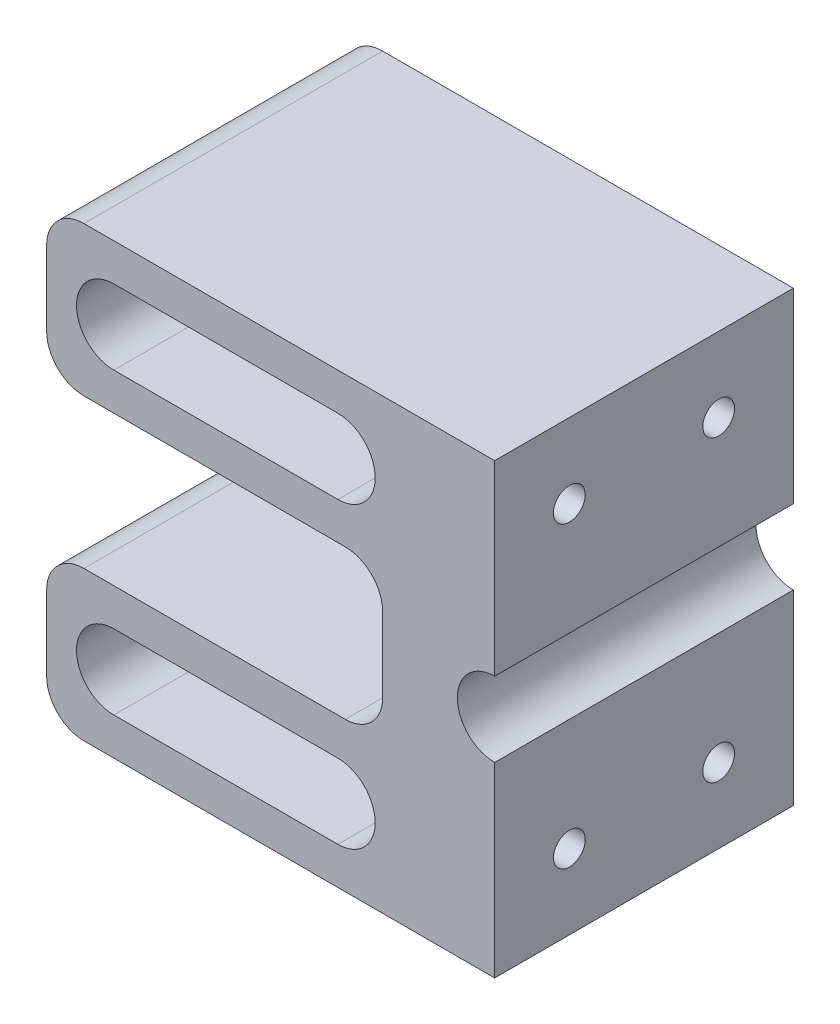
ISO-10303-21;
HEADER;
FILE_DESCRIPTION(('STEP AP214'),'2;1');
FILE_NAME('part.step','',(''),(''),'','','');
FILE_SCHEMA(('AUTOMOTIVE_DESIGN { 1 0 10303 214 1 1 1 1 }'));
ENDSEC;
DATA;
#1=APPLICATION_CONTEXT('core data for automotive mechanical design processes');
#2=APPLICATION_PROTOCOL_DEFINITION('international standard','automotive_design',2000,#1);
#3=PRODUCT_CONTEXT('',#1,'mechanical');
#4=PRODUCT('Part','Part','',(#3));
#5=PRODUCT_RELATED_PRODUCT_CATEGORY('part','',(#4));
#6=PRODUCT_DEFINITION_FORMATION('','',#4);
#7=PRODUCT_DEFINITION_CONTEXT('part definition',#1,'design');
#8=PRODUCT_DEFINITION('design','',#6,#7);
#9=PRODUCT_DEFINITION_SHAPE('','',#8);
#10=(LENGTH_UNIT() NAMED_UNIT(*) SI_UNIT(.MILLI.,.METRE.));
#11=(NAMED_UNIT(*) PLANE_ANGLE_UNIT() SI_UNIT($,.RADIAN.));
#12=(NAMED_UNIT(*) SI_UNIT($,.STERADIAN.) SOLID_ANGLE_UNIT());
#13=UNCERTAINTY_MEASURE_WITH_UNIT(LENGTH_MEASURE(1.E-05),#10,'distance_accuracy_value','');
#14=(GEOMETRIC_REPRESENTATION_CONTEXT(3) GLOBAL_UNCERTAINTY_ASSIGNED_CONTEXT((#13)) GLOBAL_UNIT_ASSIGNED_CONTEXT((#10,
#11,#12)) REPRESENTATION_CONTEXT('',''));
#15=CARTESIAN_POINT('',(0.,0.,0.));
#16=DIRECTION('',(0.,0.,1.));
#17=DIRECTION('',(1.,0.,0.));
#18=AXIS2_PLACEMENT_3D('',#15,#16,#17);
#19=CARTESIAN_POINT('',(0.,0.,12.7));
#20=DIRECTION('',(0.,0.,-1.));
#21=DIRECTION('',(-1.,0.,0.));
#22=AXIS2_PLACEMENT_3D('',#19,#20,#21);
#23=PLANE('',#22);
#24=CARTESIAN_POINT('',(-13.335,-19.05,12.7));
#25=DIRECTION('',(0.,0.,-1.));
#26=DIRECTION('',(1.,0.,0.));
#27=AXIS2_PLACEMENT_3D('',#24,#25,#26);
#28=CIRCLE('',#27,3.175);
#29=CARTESIAN_POINT('',(-13.335,-22.225,12.7));
#30=VERTEX_POINT('',#29);
#31=CARTESIAN_POINT('',(-13.335,-15.875,12.7));
#32=VERTEX_POINT('',#31);
#33=EDGE_CURVE('E331',#30,#32,#28,.T.);
#34=ORIENTED_EDGE('',*,*,#33,.T.);
#35=DIRECTION('',(1.,0.,0.));
#36=VECTOR('',#35,1.);
#37=CARTESIAN_POINT('',(-13.335,-15.875,12.7));
#38=LINE('',#37,#36);
#39=CARTESIAN_POINT('',(5.715,-15.875,12.7));
#40=VERTEX_POINT('',#39);
#41=EDGE_CURVE('E344',#32,#40,#38,.T.);
#42=ORIENTED_EDGE('',*,*,#41,.T.);
#43=CARTESIAN_POINT('',(5.715,-19.05,12.7));
#44=DIRECTION('',(0.,0.,-1.));
#45=DIRECTION('',(1.,0.,0.));
#46=AXIS2_PLACEMENT_3D('',#43,#44,#45);
#47=CIRCLE('',#46,3.175);
#48=CARTESIAN_POINT('',(5.715,-22.225,12.7));
#49=VERTEX_POINT('',#48);
#50=EDGE_CURVE('E362',#40,#49,#47,.T.);
#51=ORIENTED_EDGE('',*,*,#50,.T.);
#52=DIRECTION('',(-1.,0.,0.));
#53=VECTOR('',#52,1.);
#54=CARTESIAN_POINT('',(-13.335,-22.225,12.7));
#55=LINE('',#54,#53);
#56=EDGE_CURVE('E358',#49,#30,#55,.T.);
#57=ORIENTED_EDGE('',*,*,#56,.T.);
#58=EDGE_LOOP('',(#34,#42,#51,#57));
#59=FACE_BOUND('',#58,.T.);
#60=DIRECTION('',(1.,0.,0.));
#61=VECTOR('',#60,1.);
#62=CARTESIAN_POINT('',(-13.335,3.175,12.7));
#63=LINE('',#62,#61);
#64=CARTESIAN_POINT('',(-13.335,3.175,12.7));
#65=VERTEX_POINT('',#64);
#66=CARTESIAN_POINT('',(5.715,3.17500000000001,12.7));
#67=VERTEX_POINT('',#66);
#68=EDGE_CURVE('E453',#65,#67,#63,.T.);
#69=ORIENTED_EDGE('',*,*,#68,.F.);
#70=CARTESIAN_POINT('',(-13.335,6.35,12.7));
#71=DIRECTION('',(0.,0.,1.));
#72=DIRECTION('',(1.,0.,0.));
#73=AXIS2_PLACEMENT_3D('',#70,#71,#72);
#74=CIRCLE('',#73,3.175);
#75=CARTESIAN_POINT('',(-13.335,9.525,12.7));
#76=VERTEX_POINT('',#75);
#77=EDGE_CURVE('E432',#76,#65,#74,.T.);
#78=ORIENTED_EDGE('',*,*,#77,.F.);
#79=DIRECTION('',(-1.,0.,0.));
#80=VECTOR('',#79,1.);
#81=CARTESIAN_POINT('',(-13.335,9.525,12.7));
#82=LINE('',#81,#80);
#83=CARTESIAN_POINT('',(5.715,9.525,12.7));
#84=VERTEX_POINT('',#83);
#85=EDGE_CURVE('E438',#84,#76,#82,.T.);
#86=ORIENTED_EDGE('',*,*,#85,.F.);
#87=CARTESIAN_POINT('',(5.715,6.35,12.7));
#88=DIRECTION('',(0.,0.,1.));
#89=DIRECTION('',(1.,0.,0.));
#90=AXIS2_PLACEMENT_3D('',#87,#88,#89);
#91=CIRCLE('',#90,3.175);
#92=EDGE_CURVE('E457',#67,#84,#91,.T.);
#93=ORIENTED_EDGE('',*,*,#92,.F.);
#94=EDGE_LOOP('',(#69,#78,#86,#93));
#95=FACE_BOUND('',#94,.T.);
#96=DIRECTION('',(-1.,0.,0.));
#97=VECTOR('',#96,1.);
#98=CARTESIAN_POINT('',(-19.05,-12.7,12.7));
#99=LINE('',#98,#97);
#100=CARTESIAN_POINT('',(6.34999999999999,-12.7,12.7));
#101=VERTEX_POINT('',#100);
#102=CARTESIAN_POINT('',(-15.875,-12.7,12.7));
#103=VERTEX_POINT('',#102);
#104=EDGE_CURVE('E335',#101,#103,#99,.T.);
#105=ORIENTED_EDGE('',*,*,#104,.T.);
#106=CARTESIAN_POINT('',(-15.875,-15.875,12.7));
#107=DIRECTION('',(0.,0.,-1.));
#108=DIRECTION('',(-1.,0.,0.));
#109=AXIS2_PLACEMENT_3D('',#106,#107,#108);
#110=CIRCLE('',#109,3.175);
#111=CARTESIAN_POINT('',(-19.05,-15.875,12.7));
#112=VERTEX_POINT('',#111);
#113=EDGE_CURVE('E282',#103,#112,#110,.F.);
#114=ORIENTED_EDGE('',*,*,#113,.T.);
#115=DIRECTION('',(0.,1.,0.));
#116=VECTOR('',#115,1.);
#117=CARTESIAN_POINT('',(-19.05,0.,12.7));
#118=LINE('',#117,#116);
#119=CARTESIAN_POINT('',(-19.05,-22.225,12.7));
#120=VERTEX_POINT('',#119);
#121=EDGE_CURVE('E414',#120,#112,#118,.T.);
#122=ORIENTED_EDGE('',*,*,#121,.F.);
#123=CARTESIAN_POINT('',(-15.875,-22.225,12.7));
#124=DIRECTION('',(0.,0.,-1.));
#125=DIRECTION('',(-1.,0.,0.));
#126=AXIS2_PLACEMENT_3D('',#123,#124,#125);
#127=CIRCLE('',#126,3.175);
#128=CARTESIAN_POINT('',(-15.875,-25.4,12.7));
#129=VERTEX_POINT('',#128);
#130=EDGE_CURVE('E279',#120,#129,#127,.F.);
#131=ORIENTED_EDGE('',*,*,#130,.T.);
#132=DIRECTION('',(-1.,0.,0.));
#133=VECTOR('',#132,1.);
#134=CARTESIAN_POINT('',(-19.05,-25.4,12.7));
#135=LINE('',#134,#133);
#136=CARTESIAN_POINT('',(19.05,-25.4,12.7));
#137=VERTEX_POINT('',#136);
#138=EDGE_CURVE('E418',#137,#129,#135,.T.);
#139=ORIENTED_EDGE('',*,*,#138,.F.);
#140=DIRECTION('',(0.,1.,0.));
#141=VECTOR('',#140,1.);
#142=CARTESIAN_POINT('',(19.05,-12.7,12.7));
#143=LINE('',#142,#141);
#144=CARTESIAN_POINT('',(19.05,-9.525,12.7));
#145=VERTEX_POINT('',#144);
#146=EDGE_CURVE('E493',#137,#145,#143,.T.);
#147=ORIENTED_EDGE('',*,*,#146,.T.);
#148=CARTESIAN_POINT('',(19.05,-6.35,12.7));
#149=DIRECTION('',(0.,0.,-1.));
#150=DIRECTION('',(1.,0.,0.));
#151=AXIS2_PLACEMENT_3D('',#148,#149,#150);
#152=CIRCLE('',#151,3.175);
#153=CARTESIAN_POINT('',(19.05,-3.175,12.7));
#154=VERTEX_POINT('',#153);
#155=EDGE_CURVE('E406',#145,#154,#152,.T.);
#156=ORIENTED_EDGE('',*,*,#155,.T.);
#157=CARTESIAN_POINT('',(19.05,12.7,12.7));
#158=VERTEX_POINT('',#157);
#159=EDGE_CURVE('E498',#154,#158,#143,.T.);
#160=ORIENTED_EDGE('',*,*,#159,.T.);
#161=DIRECTION('',(-1.,0.,0.));
#162=VECTOR('',#161,1.);
#163=CARTESIAN_POINT('',(-19.05,12.7,12.7));
#164=LINE('',#163,#162);
#165=CARTESIAN_POINT('',(-15.875,12.7,12.7));
#166=VERTEX_POINT('',#165);
#167=EDGE_CURVE('E497',#158,#166,#164,.T.);
#168=ORIENTED_EDGE('',*,*,#167,.T.);
#169=CARTESIAN_POINT('',(-15.875,9.525,12.7));
#170=DIRECTION('',(0.,0.,-1.));
#171=DIRECTION('',(-1.,0.,0.));
#172=AXIS2_PLACEMENT_3D('',#169,#170,#171);
#173=CIRCLE('',#172,3.175);
#174=CARTESIAN_POINT('',(-19.05,9.525,12.7));
#175=VERTEX_POINT('',#174);
#176=EDGE_CURVE('E239',#166,#175,#173,.F.);
#177=ORIENTED_EDGE('',*,*,#176,.T.);
#178=DIRECTION('',(0.,-1.,0.));
#179=VECTOR('',#178,1.);
#180=CARTESIAN_POINT('',(-19.05,-12.7,12.7));
#181=LINE('',#180,#179);
#182=CARTESIAN_POINT('',(-19.05,3.175,12.7));
#183=VERTEX_POINT('',#182);
#184=EDGE_CURVE('E233',#175,#183,#181,.T.);
#185=ORIENTED_EDGE('',*,*,#184,.T.);
#186=CARTESIAN_POINT('',(-15.875,3.175,12.7));
#187=DIRECTION('',(0.,0.,-1.));
#188=DIRECTION('',(-1.,0.,0.));
#189=AXIS2_PLACEMENT_3D('',#186,#187,#188);
#190=CIRCLE('',#189,3.175);
#191=CARTESIAN_POINT('',(-15.875,0.,12.7));
#192=VERTEX_POINT('',#191);
#193=EDGE_CURVE('E230',#183,#192,#190,.F.);
#194=ORIENTED_EDGE('',*,*,#193,.T.);
#195=DIRECTION('',(1.,0.,0.));
#196=VECTOR('',#195,1.);
#197=CARTESIAN_POINT('',(-19.05,0.,12.7));
#198=LINE('',#197,#196);
#199=CARTESIAN_POINT('',(6.34999999999999,0.,12.7));
#200=VERTEX_POINT('',#199);
#201=EDGE_CURVE('E216',#192,#200,#198,.T.);
#202=ORIENTED_EDGE('',*,*,#201,.T.);
#203=CARTESIAN_POINT('',(6.35,-3.175,12.7));
#204=DIRECTION('',(0.,0.,-1.));
#205=DIRECTION('',(-1.,0.,0.));
#206=AXIS2_PLACEMENT_3D('',#203,#204,#205);
#207=CIRCLE('',#206,3.175);
#208=CARTESIAN_POINT('',(9.525,-3.175,12.7));
#209=VERTEX_POINT('',#208);
#210=EDGE_CURVE('E54',#200,#209,#207,.T.);
#211=ORIENTED_EDGE('',*,*,#210,.T.);
#212=DIRECTION('',(0.,-1.,0.));
#213=VECTOR('',#212,1.);
#214=CARTESIAN_POINT('',(9.525,0.,12.7));
#215=LINE('',#214,#213);
#216=CARTESIAN_POINT('',(9.525,-9.525,12.7));
#217=VERTEX_POINT('',#216);
#218=EDGE_CURVE('E227',#209,#217,#215,.T.);
#219=ORIENTED_EDGE('',*,*,#218,.T.);
#220=CARTESIAN_POINT('',(6.35,-9.525,12.7));
#221=DIRECTION('',(0.,0.,-1.));
#222=DIRECTION('',(-1.,0.,0.));
#223=AXIS2_PLACEMENT_3D('',#220,#221,#222);
#224=CIRCLE('',#223,3.175);
#225=EDGE_CURVE('E301',#217,#101,#224,.T.);
#226=ORIENTED_EDGE('',*,*,#225,.T.);
#227=EDGE_LOOP('',(#105,#114,#122,#131,#139,#147,#156,#160,#168,#177,#185,#194,#202,#211,#219,#226));
#228=FACE_BOUND('',#227,.T.);
#229=ADVANCED_FACE('F45',(#59,#95,#228),#23,.F.);
#230=CARTESIAN_POINT('',(0.,0.,-12.7));
#231=DIRECTION('',(0.,0.,-1.));
#232=DIRECTION('',(-1.,0.,0.));
#233=AXIS2_PLACEMENT_3D('',#230,#231,#232);
#234=PLANE('',#233);
#235=CARTESIAN_POINT('',(-13.335,6.35,-12.7));
#236=DIRECTION('',(0.,0.,1.));
#237=DIRECTION('',(1.,0.,0.));
#238=AXIS2_PLACEMENT_3D('',#235,#236,#237);
#239=CIRCLE('',#238,3.175);
#240=CARTESIAN_POINT('',(-13.335,9.525,-12.7));
#241=VERTEX_POINT('',#240);
#242=CARTESIAN_POINT('',(-13.335,3.175,-12.7));
#243=VERTEX_POINT('',#242);
#244=EDGE_CURVE('E433',#241,#243,#239,.T.);
#245=ORIENTED_EDGE('',*,*,#244,.T.);
#246=DIRECTION('',(1.,0.,0.));
#247=VECTOR('',#246,1.);
#248=CARTESIAN_POINT('',(-13.335,3.175,-12.7));
#249=LINE('',#248,#247);
#250=CARTESIAN_POINT('',(5.715,3.17500000000001,-12.7));
#251=VERTEX_POINT('',#250);
#252=EDGE_CURVE('E437',#243,#251,#249,.T.);
#253=ORIENTED_EDGE('',*,*,#252,.T.);
#254=CARTESIAN_POINT('',(5.715,6.35,-12.7));
#255=DIRECTION('',(0.,0.,1.));
#256=DIRECTION('',(1.,0.,0.));
#257=AXIS2_PLACEMENT_3D('',#254,#255,#256);
#258=CIRCLE('',#257,3.175);
#259=CARTESIAN_POINT('',(5.715,9.525,-12.7));
#260=VERTEX_POINT('',#259);
#261=EDGE_CURVE('E442',#251,#260,#258,.T.);
#262=ORIENTED_EDGE('',*,*,#261,.T.);
#263=DIRECTION('',(-1.,0.,0.));
#264=VECTOR('',#263,1.);
#265=CARTESIAN_POINT('',(-13.335,9.525,-12.7));
#266=LINE('',#265,#264);
#267=EDGE_CURVE('E446',#260,#241,#266,.T.);
#268=ORIENTED_EDGE('',*,*,#267,.T.);
#269=EDGE_LOOP('',(#245,#253,#262,#268));
#270=FACE_BOUND('',#269,.T.);
#271=DIRECTION('',(1.,0.,0.));
#272=VECTOR('',#271,1.);
#273=CARTESIAN_POINT('',(-13.335,-15.875,-12.7));
#274=LINE('',#273,#272);
#275=CARTESIAN_POINT('',(-13.335,-15.875,-12.7));
#276=VERTEX_POINT('',#275);
#277=CARTESIAN_POINT('',(5.715,-15.875,-12.7));
#278=VERTEX_POINT('',#277);
#279=EDGE_CURVE('E351',#276,#278,#274,.T.);
#280=ORIENTED_EDGE('',*,*,#279,.F.);
#281=CARTESIAN_POINT('',(-13.335,-19.05,-12.7));
#282=DIRECTION('',(0.,0.,-1.));
#283=DIRECTION('',(1.,0.,0.));
#284=AXIS2_PLACEMENT_3D('',#281,#282,#283);
#285=CIRCLE('',#284,3.175);
#286=CARTESIAN_POINT('',(-13.335,-22.225,-12.7));
#287=VERTEX_POINT('',#286);
#288=EDGE_CURVE('E340',#287,#276,#285,.T.);
#289=ORIENTED_EDGE('',*,*,#288,.F.);
#290=DIRECTION('',(-1.,0.,0.));
#291=VECTOR('',#290,1.);
#292=CARTESIAN_POINT('',(-13.335,-22.225,-12.7));
#293=LINE('',#292,#291);
#294=CARTESIAN_POINT('',(5.715,-22.225,-12.7));
#295=VERTEX_POINT('',#294);
#296=EDGE_CURVE('E343',#295,#287,#293,.T.);
#297=ORIENTED_EDGE('',*,*,#296,.F.);
#298=CARTESIAN_POINT('',(5.715,-19.05,-12.7));
#299=DIRECTION('',(0.,0.,-1.));
#300=DIRECTION('',(1.,0.,0.));
#301=AXIS2_PLACEMENT_3D('',#298,#299,#300);
#302=CIRCLE('',#301,3.175);
#303=EDGE_CURVE('E347',#278,#295,#302,.T.);
#304=ORIENTED_EDGE('',*,*,#303,.F.);
#305=EDGE_LOOP('',(#280,#289,#297,#304));
#306=FACE_BOUND('',#305,.T.);
#307=DIRECTION('',(0.,1.,0.));
#308=VECTOR('',#307,1.);
#309=CARTESIAN_POINT('',(-19.05,0.,-12.7));
#310=LINE('',#309,#308);
#311=CARTESIAN_POINT('',(-19.05,-22.225,-12.7));
#312=VERTEX_POINT('',#311);
#313=CARTESIAN_POINT('',(-19.05,-15.875,-12.7));
#314=VERTEX_POINT('',#313);
#315=EDGE_CURVE('E413',#312,#314,#310,.T.);
#316=ORIENTED_EDGE('',*,*,#315,.T.);
#317=CARTESIAN_POINT('',(-15.875,-15.875,-12.7));
#318=DIRECTION('',(0.,0.,-1.));
#319=DIRECTION('',(-1.,0.,0.));
#320=AXIS2_PLACEMENT_3D('',#317,#318,#319);
#321=CIRCLE('',#320,3.175);
#322=CARTESIAN_POINT('',(-15.875,-12.7,-12.7));
#323=VERTEX_POINT('',#322);
#324=EDGE_CURVE('E294',#314,#323,#321,.T.);
#325=ORIENTED_EDGE('',*,*,#324,.T.);
#326=DIRECTION('',(-1.,0.,0.));
#327=VECTOR('',#326,1.);
#328=CARTESIAN_POINT('',(-19.05,-12.7,-12.7));
#329=LINE('',#328,#327);
#330=CARTESIAN_POINT('',(6.34999999999999,-12.7,-12.7));
#331=VERTEX_POINT('',#330);
#332=EDGE_CURVE('E226',#331,#323,#329,.T.);
#333=ORIENTED_EDGE('',*,*,#332,.F.);
#334=CARTESIAN_POINT('',(6.35,-9.525,-12.7));
#335=DIRECTION('',(0.,0.,-1.));
#336=DIRECTION('',(-1.,0.,0.));
#337=AXIS2_PLACEMENT_3D('',#334,#335,#336);
#338=CIRCLE('',#337,3.175);
#339=CARTESIAN_POINT('',(9.525,-9.525,-12.7));
#340=VERTEX_POINT('',#339);
#341=EDGE_CURVE('E304',#331,#340,#338,.F.);
#342=ORIENTED_EDGE('',*,*,#341,.T.);
#343=DIRECTION('',(0.,-1.,0.));
#344=VECTOR('',#343,1.);
#345=CARTESIAN_POINT('',(9.525,0.,-12.7));
#346=LINE('',#345,#344);
#347=CARTESIAN_POINT('',(9.525,-3.175,-12.7));
#348=VERTEX_POINT('',#347);
#349=EDGE_CURVE('E318',#348,#340,#346,.T.);
#350=ORIENTED_EDGE('',*,*,#349,.F.);
#351=CARTESIAN_POINT('',(6.35,-3.175,-12.7));
#352=DIRECTION('',(0.,0.,-1.));
#353=DIRECTION('',(-1.,0.,0.));
#354=AXIS2_PLACEMENT_3D('',#351,#352,#353);
#355=CIRCLE('',#354,3.175);
#356=CARTESIAN_POINT('',(6.34999999999999,0.,-12.7));
#357=VERTEX_POINT('',#356);
#358=EDGE_CURVE('E11',#348,#357,#355,.F.);
#359=ORIENTED_EDGE('',*,*,#358,.T.);
#360=DIRECTION('',(1.,0.,0.));
#361=VECTOR('',#360,1.);
#362=CARTESIAN_POINT('',(-19.05,0.,-12.7));
#363=LINE('',#362,#361);
#364=CARTESIAN_POINT('',(-15.875,0.,-12.7));
#365=VERTEX_POINT('',#364);
#366=EDGE_CURVE('E327',#365,#357,#363,.T.);
#367=ORIENTED_EDGE('',*,*,#366,.F.);
#368=CARTESIAN_POINT('',(-15.875,3.175,-12.7));
#369=DIRECTION('',(0.,0.,-1.));
#370=DIRECTION('',(-1.,0.,0.));
#371=AXIS2_PLACEMENT_3D('',#368,#369,#370);
#372=CIRCLE('',#371,3.175);
#373=CARTESIAN_POINT('',(-19.05,3.175,-12.7));
#374=VERTEX_POINT('',#373);
#375=EDGE_CURVE('E243',#365,#374,#372,.T.);
#376=ORIENTED_EDGE('',*,*,#375,.T.);
#377=DIRECTION('',(0.,-1.,0.));
#378=VECTOR('',#377,1.);
#379=CARTESIAN_POINT('',(-19.05,-12.7,-12.7));
#380=LINE('',#379,#378);
#381=CARTESIAN_POINT('',(-19.05,9.525,-12.7));
#382=VERTEX_POINT('',#381);
#383=EDGE_CURVE('E511',#382,#374,#380,.T.);
#384=ORIENTED_EDGE('',*,*,#383,.F.);
#385=CARTESIAN_POINT('',(-15.875,9.525,-12.7));
#386=DIRECTION('',(0.,0.,-1.));
#387=DIRECTION('',(-1.,0.,0.));
#388=AXIS2_PLACEMENT_3D('',#385,#386,#387);
#389=CIRCLE('',#388,3.175);
#390=CARTESIAN_POINT('',(-15.875,12.7,-12.7));
#391=VERTEX_POINT('',#390);
#392=EDGE_CURVE('E238',#382,#391,#389,.T.);
#393=ORIENTED_EDGE('',*,*,#392,.T.);
#394=DIRECTION('',(-1.,0.,0.));
#395=VECTOR('',#394,1.);
#396=CARTESIAN_POINT('',(-19.05,12.7,-12.7));
#397=LINE('',#396,#395);
#398=CARTESIAN_POINT('',(19.05,12.7,-12.7));
#399=VERTEX_POINT('',#398);
#400=EDGE_CURVE('E508',#399,#391,#397,.T.);
#401=ORIENTED_EDGE('',*,*,#400,.F.);
#402=DIRECTION('',(0.,1.,0.));
#403=VECTOR('',#402,1.);
#404=CARTESIAN_POINT('',(19.05,-12.7,-12.7));
#405=LINE('',#404,#403);
#406=CARTESIAN_POINT('',(19.05,-3.175,-12.7));
#407=VERTEX_POINT('',#406);
#408=EDGE_CURVE('E492',#407,#399,#405,.T.);
#409=ORIENTED_EDGE('',*,*,#408,.F.);
#410=CARTESIAN_POINT('',(19.05,-6.35,-12.7));
#411=DIRECTION('',(0.,0.,-1.));
#412=DIRECTION('',(-1.,0.,0.));
#413=AXIS2_PLACEMENT_3D('',#410,#411,#412);
#414=CIRCLE('',#413,3.175);
#415=CARTESIAN_POINT('',(19.05,-9.525,-12.7));
#416=VERTEX_POINT('',#415);
#417=EDGE_CURVE('E410',#416,#407,#414,.T.);
#418=ORIENTED_EDGE('',*,*,#417,.F.);
#419=CARTESIAN_POINT('',(19.05,-25.4,-12.7));
#420=VERTEX_POINT('',#419);
#421=EDGE_CURVE('E504',#420,#416,#405,.T.);
#422=ORIENTED_EDGE('',*,*,#421,.F.);
#423=DIRECTION('',(-1.,0.,0.));
#424=VECTOR('',#423,1.);
#425=CARTESIAN_POINT('',(-19.05,-25.4,-12.7));
#426=LINE('',#425,#424);
#427=CARTESIAN_POINT('',(-15.875,-25.4,-12.7));
#428=VERTEX_POINT('',#427);
#429=EDGE_CURVE('E419',#420,#428,#426,.T.);
#430=ORIENTED_EDGE('',*,*,#429,.T.);
#431=CARTESIAN_POINT('',(-15.875,-22.225,-12.7));
#432=DIRECTION('',(0.,0.,-1.));
#433=DIRECTION('',(-1.,0.,0.));
#434=AXIS2_PLACEMENT_3D('',#431,#432,#433);
#435=CIRCLE('',#434,3.175);
#436=EDGE_CURVE('E291',#428,#312,#435,.T.);
#437=ORIENTED_EDGE('',*,*,#436,.T.);
#438=EDGE_LOOP('',(#316,#325,#333,#342,#350,#359,#367,#376,#384,#393,#401,#409,#418,#422,#430,#437));
#439=FACE_BOUND('',#438,.T.);
#440=ADVANCED_FACE('F317',(#270,#306,#439),#234,.T.);
#441=CARTESIAN_POINT('',(-19.05,0.,12.7));
#442=DIRECTION('',(-1.,0.,0.));
#443=DIRECTION('',(0.,0.,1.));
#444=AXIS2_PLACEMENT_3D('',#441,#442,#443);
#445=PLANE('',#444);
#446=ORIENTED_EDGE('',*,*,#121,.T.);
#447=DIRECTION('',(0.,0.,1.));
#448=VECTOR('',#447,1.);
#449=CARTESIAN_POINT('',(-19.05,-15.875,12.7));
#450=LINE('',#449,#448);
#451=EDGE_CURVE('E288',#112,#314,#450,.F.);
#452=ORIENTED_EDGE('',*,*,#451,.T.);
#453=ORIENTED_EDGE('',*,*,#315,.F.);
#454=DIRECTION('',(0.,0.,-1.));
#455=VECTOR('',#454,1.);
#456=CARTESIAN_POINT('',(-19.05,-22.225,12.7));
#457=LINE('',#456,#455);
#458=EDGE_CURVE('E285',#312,#120,#457,.F.);
#459=ORIENTED_EDGE('',*,*,#458,.T.);
#460=EDGE_LOOP('',(#446,#452,#453,#459));
#461=FACE_BOUND('',#460,.T.);
#462=ADVANCED_FACE('F548',(#461),#445,.T.);
#463=CARTESIAN_POINT('',(19.05,-12.7,12.7));
#464=DIRECTION('',(-1.,0.,0.));
#465=DIRECTION('',(0.,0.,1.));
#466=AXIS2_PLACEMENT_3D('',#463,#464,#465);
#467=PLANE('',#466);
#468=CARTESIAN_POINT('',(19.05,-19.05,6.35));
#469=DIRECTION('',(1.,0.,0.));
#470=DIRECTION('',(0.,0.,-1.));
#471=AXIS2_PLACEMENT_3D('',#468,#469,#470);
#472=CIRCLE('',#471,1.35255);
#473=CARTESIAN_POINT('',(19.05,-19.05,4.99745));
#474=VERTEX_POINT('',#473);
#475=EDGE_CURVE('E373',#474,#474,#472,.T.);
#476=ORIENTED_EDGE('',*,*,#475,.F.);
#477=EDGE_LOOP('',(#476));
#478=FACE_BOUND('',#477,.T.);
#479=DIRECTION('',(0.,0.,1.));
#480=VECTOR('',#479,1.);
#481=CARTESIAN_POINT('',(19.05,-9.525,-12.701));
#482=LINE('',#481,#480);
#483=EDGE_CURVE('E402',#416,#145,#482,.T.);
#484=ORIENTED_EDGE('',*,*,#483,.T.);
#485=ORIENTED_EDGE('',*,*,#146,.F.);
#486=DIRECTION('',(0.,0.,-1.));
#487=VECTOR('',#486,1.);
#488=CARTESIAN_POINT('',(19.05,-25.4,12.7));
#489=LINE('',#488,#487);
#490=EDGE_CURVE('E423',#137,#420,#489,.T.);
#491=ORIENTED_EDGE('',*,*,#490,.T.);
#492=ORIENTED_EDGE('',*,*,#421,.T.);
#493=EDGE_LOOP('',(#484,#485,#491,#492));
#494=FACE_BOUND('',#493,.T.);
#495=CARTESIAN_POINT('',(19.05,-19.05,-6.35));
#496=DIRECTION('',(1.,0.,0.));
#497=DIRECTION('',(0.,0.,-1.));
#498=AXIS2_PLACEMENT_3D('',#495,#496,#497);
#499=CIRCLE('',#498,1.35255);
#500=CARTESIAN_POINT('',(19.05,-19.05,-7.70255));
#501=VERTEX_POINT('',#500);
#502=EDGE_CURVE('E390',#501,#501,#499,.T.);
#503=ORIENTED_EDGE('',*,*,#502,.F.);
#504=EDGE_LOOP('',(#503));
#505=FACE_BOUND('',#504,.T.);
#506=ADVANCED_FACE('F560',(#478,#494,#505),#467,.F.);
#507=CARTESIAN_POINT('',(19.05,6.35,-6.35));
#508=DIRECTION('',(1.,0.,0.));
#509=DIRECTION('',(0.,0.,-1.));
#510=AXIS2_PLACEMENT_3D('',#507,#508,#509);
#511=CIRCLE('',#510,1.35255);
#512=CARTESIAN_POINT('',(19.05,6.35,-7.70255));
#513=VERTEX_POINT('',#512);
#514=EDGE_CURVE('E484',#513,#513,#511,.T.);
#515=ORIENTED_EDGE('',*,*,#514,.F.);
#516=EDGE_LOOP('',(#515));
#517=FACE_BOUND('',#516,.T.);
#518=CARTESIAN_POINT('',(19.05,6.35,6.35));
#519=DIRECTION('',(1.,0.,0.));
#520=DIRECTION('',(0.,0.,-1.));
#521=AXIS2_PLACEMENT_3D('',#518,#519,#520);
#522=CIRCLE('',#521,1.35255);
#523=CARTESIAN_POINT('',(19.05,6.35,4.99745));
#524=VERTEX_POINT('',#523);
#525=EDGE_CURVE('E467',#524,#524,#522,.T.);
#526=ORIENTED_EDGE('',*,*,#525,.F.);
#527=EDGE_LOOP('',(#526));
#528=FACE_BOUND('',#527,.T.);
#529=DIRECTION('',(0.,0.,1.));
#530=VECTOR('',#529,1.);
#531=CARTESIAN_POINT('',(19.05,-3.175,-12.701));
#532=LINE('',#531,#530);
#533=EDGE_CURVE('E398',#154,#407,#532,.F.);
#534=ORIENTED_EDGE('',*,*,#533,.T.);
#535=ORIENTED_EDGE('',*,*,#408,.T.);
#536=DIRECTION('',(0.,0.,-1.));
#537=VECTOR('',#536,1.);
#538=CARTESIAN_POINT('',(19.05,12.7,12.7));
#539=LINE('',#538,#537);
#540=EDGE_CURVE('E246',#158,#399,#539,.T.);
#541=ORIENTED_EDGE('',*,*,#540,.F.);
#542=ORIENTED_EDGE('',*,*,#159,.F.);
#543=EDGE_LOOP('',(#534,#535,#541,#542));
#544=FACE_BOUND('',#543,.T.);
#545=ADVANCED_FACE('F525',(#517,#528,#544),#467,.F.);
#546=CARTESIAN_POINT('',(-19.05,12.7,12.7));
#547=DIRECTION('',(0.,-1.,0.));
#548=DIRECTION('',(0.,0.,-1.));
#549=AXIS2_PLACEMENT_3D('',#546,#547,#548);
#550=PLANE('',#549);
#551=ORIENTED_EDGE('',*,*,#400,.T.);
#552=DIRECTION('',(0.,0.,-1.));
#553=VECTOR('',#552,1.);
#554=CARTESIAN_POINT('',(-15.875,12.7,12.7));
#555=LINE('',#554,#553);
#556=EDGE_CURVE('E265',#391,#166,#555,.F.);
#557=ORIENTED_EDGE('',*,*,#556,.T.);
#558=ORIENTED_EDGE('',*,*,#167,.F.);
#559=ORIENTED_EDGE('',*,*,#540,.T.);
#560=EDGE_LOOP('',(#551,#557,#558,#559));
#561=FACE_BOUND('',#560,.T.);
#562=ADVANCED_FACE('F523',(#561),#550,.F.);
#563=CARTESIAN_POINT('',(-19.05,-12.7,12.7));
#564=DIRECTION('',(1.,0.,0.));
#565=DIRECTION('',(0.,0.,-1.));
#566=AXIS2_PLACEMENT_3D('',#563,#564,#565);
#567=PLANE('',#566);
#568=ORIENTED_EDGE('',*,*,#383,.T.);
#569=DIRECTION('',(0.,0.,1.));
#570=VECTOR('',#569,1.);
#571=CARTESIAN_POINT('',(-19.05,3.175,12.7));
#572=LINE('',#571,#570);
#573=EDGE_CURVE('E251',#374,#183,#572,.T.);
#574=ORIENTED_EDGE('',*,*,#573,.T.);
#575=ORIENTED_EDGE('',*,*,#184,.F.);
#576=DIRECTION('',(0.,0.,-1.));
#577=VECTOR('',#576,1.);
#578=CARTESIAN_POINT('',(-19.05,9.525,12.7));
#579=LINE('',#578,#577);
#580=EDGE_CURVE('E245',#175,#382,#579,.T.);
#581=ORIENTED_EDGE('',*,*,#580,.T.);
#582=EDGE_LOOP('',(#568,#574,#575,#581));
#583=FACE_BOUND('',#582,.T.);
#584=ADVANCED_FACE('F533',(#583),#567,.F.);
#585=CARTESIAN_POINT('',(10.9726940302657,6.35,-6.35));
#586=DIRECTION('',(1.,0.,0.));
#587=DIRECTION('',(0.,0.,-1.));
#588=AXIS2_PLACEMENT_3D('',#585,#586,#587);
#589=CONICAL_SURFACE('',#588,1.35255,1.02974425867665);
#590=CARTESIAN_POINT('',(10.16,6.35,-6.35));
#591=VERTEX_POINT('',#590);
#592=VERTEX_LOOP('',#591);
#593=FACE_BOUND('',#592,.T.);
#594=CARTESIAN_POINT('',(10.9726940302657,6.35,-6.35));
#595=DIRECTION('',(1.,0.,0.));
#596=DIRECTION('',(0.,0.,-1.));
#597=AXIS2_PLACEMENT_3D('',#594,#595,#596);
#598=CIRCLE('',#597,1.35255);
#599=CARTESIAN_POINT('',(10.9726940302657,6.35,-7.70255));
#600=VERTEX_POINT('',#599);
#601=EDGE_CURVE('E488',#600,#600,#598,.T.);
#602=ORIENTED_EDGE('',*,*,#601,.T.);
#603=EDGE_LOOP('',(#602));
#604=FACE_BOUND('',#603,.T.);
#605=ADVANCED_FACE('F553',(#593,#604),#589,.F.);
#606=CARTESIAN_POINT('',(19.05,6.35,-6.35));
#607=DIRECTION('',(1.,0.,0.));
#608=DIRECTION('',(0.,0.,-1.));
#609=AXIS2_PLACEMENT_3D('',#606,#607,#608);
#610=CYLINDRICAL_SURFACE('',#609,1.35255);
#611=ORIENTED_EDGE('',*,*,#601,.F.);
#612=EDGE_LOOP('',(#611));
#613=FACE_BOUND('',#612,.T.);
#614=ORIENTED_EDGE('',*,*,#514,.T.);
#615=EDGE_LOOP('',(#614));
#616=FACE_BOUND('',#615,.T.);
#617=ADVANCED_FACE('F632',(#613,#616),#610,.F.);
#618=CARTESIAN_POINT('',(10.9726940302657,6.35,6.35));
#619=DIRECTION('',(1.,0.,0.));
#620=DIRECTION('',(0.,0.,-1.));
#621=AXIS2_PLACEMENT_3D('',#618,#619,#620);
#622=CONICAL_SURFACE('',#621,1.35255,1.02974425867665);
#623=CARTESIAN_POINT('',(10.16,6.35,6.35));
#624=VERTEX_POINT('',#623);
#625=VERTEX_LOOP('',#624);
#626=FACE_BOUND('',#625,.T.);
#627=CARTESIAN_POINT('',(10.9726940302657,6.35,6.35));
#628=DIRECTION('',(1.,0.,0.));
#629=DIRECTION('',(0.,0.,-1.));
#630=AXIS2_PLACEMENT_3D('',#627,#628,#629);
#631=CIRCLE('',#630,1.35255);
#632=CARTESIAN_POINT('',(10.9726940302657,6.35,4.99745));
#633=VERTEX_POINT('',#632);
#634=EDGE_CURVE('E480',#633,#633,#631,.T.);
#635=ORIENTED_EDGE('',*,*,#634,.T.);
#636=EDGE_LOOP('',(#635));
#637=FACE_BOUND('',#636,.T.);
#638=ADVANCED_FACE('F629',(#626,#637),#622,.F.);
#639=CARTESIAN_POINT('',(19.05,6.35,6.35));
#640=DIRECTION('',(1.,0.,0.));
#641=DIRECTION('',(0.,0.,-1.));
#642=AXIS2_PLACEMENT_3D('',#639,#640,#641);
#643=CYLINDRICAL_SURFACE('',#642,1.35255);
#644=ORIENTED_EDGE('',*,*,#634,.F.);
#645=EDGE_LOOP('',(#644));
#646=FACE_BOUND('',#645,.T.);
#647=ORIENTED_EDGE('',*,*,#525,.T.);
#648=EDGE_LOOP('',(#647));
#649=FACE_BOUND('',#648,.T.);
#650=ADVANCED_FACE('F625',(#646,#649),#643,.F.);
#651=CARTESIAN_POINT('',(-13.335,6.35,-12.7));
#652=DIRECTION('',(0.,0.,1.));
#653=DIRECTION('',(1.,0.,0.));
#654=AXIS2_PLACEMENT_3D('',#651,#652,#653);
#655=CYLINDRICAL_SURFACE('',#654,3.175);
#656=ORIENTED_EDGE('',*,*,#77,.T.);
#657=DIRECTION('',(0.,0.,1.));
#658=VECTOR('',#657,1.);
#659=CARTESIAN_POINT('',(-13.335,3.175,-12.7));
#660=LINE('',#659,#658);
#661=EDGE_CURVE('E450',#243,#65,#660,.T.);
#662=ORIENTED_EDGE('',*,*,#661,.F.);
#663=ORIENTED_EDGE('',*,*,#244,.F.);
#664=DIRECTION('',(0.,0.,1.));
#665=VECTOR('',#664,1.);
#666=CARTESIAN_POINT('',(-13.335,9.525,-12.7));
#667=LINE('',#666,#665);
#668=EDGE_CURVE('E464',#241,#76,#667,.T.);
#669=ORIENTED_EDGE('',*,*,#668,.T.);
#670=EDGE_LOOP('',(#656,#662,#663,#669));
#671=FACE_BOUND('',#670,.T.);
#672=ADVANCED_FACE('F615',(#671),#655,.F.);
#673=CARTESIAN_POINT('',(-13.335,9.525,-12.7));
#674=DIRECTION('',(0.,1.,0.));
#675=DIRECTION('',(-1.,0.,0.));
#676=AXIS2_PLACEMENT_3D('',#673,#674,#675);
#677=PLANE('',#676);
#678=ORIENTED_EDGE('',*,*,#85,.T.);
#679=ORIENTED_EDGE('',*,*,#668,.F.);
#680=ORIENTED_EDGE('',*,*,#267,.F.);
#681=DIRECTION('',(0.,0.,1.));
#682=VECTOR('',#681,1.);
#683=CARTESIAN_POINT('',(5.715,9.525,-12.7));
#684=LINE('',#683,#682);
#685=EDGE_CURVE('E468',#260,#84,#684,.T.);
#686=ORIENTED_EDGE('',*,*,#685,.T.);
#687=EDGE_LOOP('',(#678,#679,#680,#686));
#688=FACE_BOUND('',#687,.T.);
#689=ADVANCED_FACE('F611',(#688),#677,.F.);
#690=CARTESIAN_POINT('',(5.715,6.35,-12.7));
#691=DIRECTION('',(0.,0.,1.));
#692=DIRECTION('',(1.,0.,0.));
#693=AXIS2_PLACEMENT_3D('',#690,#691,#692);
#694=CYLINDRICAL_SURFACE('',#693,3.175);
#695=ORIENTED_EDGE('',*,*,#92,.T.);
#696=ORIENTED_EDGE('',*,*,#685,.F.);
#697=ORIENTED_EDGE('',*,*,#261,.F.);
#698=DIRECTION('',(0.,0.,1.));
#699=VECTOR('',#698,1.);
#700=CARTESIAN_POINT('',(5.715,3.17500000000001,-12.7));
#701=LINE('',#700,#699);
#702=EDGE_CURVE('E471',#251,#67,#701,.T.);
#703=ORIENTED_EDGE('',*,*,#702,.T.);
#704=EDGE_LOOP('',(#695,#696,#697,#703));
#705=FACE_BOUND('',#704,.T.);
#706=ADVANCED_FACE('F614',(#705),#694,.F.);
#707=CARTESIAN_POINT('',(-13.335,3.175,-12.7));
#708=DIRECTION('',(0.,-1.,0.));
#709=DIRECTION('',(1.,0.,0.));
#710=AXIS2_PLACEMENT_3D('',#707,#708,#709);
#711=PLANE('',#710);
#712=ORIENTED_EDGE('',*,*,#68,.T.);
#713=ORIENTED_EDGE('',*,*,#702,.F.);
#714=ORIENTED_EDGE('',*,*,#252,.F.);
#715=ORIENTED_EDGE('',*,*,#661,.T.);
#716=EDGE_LOOP('',(#712,#713,#714,#715));
#717=FACE_BOUND('',#716,.T.);
#718=ADVANCED_FACE('F566',(#717),#711,.F.);
#719=CARTESIAN_POINT('',(-15.875,3.175,12.7));
#720=DIRECTION('',(0.,0.,1.));
#721=DIRECTION('',(1.,0.,0.));
#722=AXIS2_PLACEMENT_3D('',#719,#720,#721);
#723=CYLINDRICAL_SURFACE('',#722,3.175);
#724=ORIENTED_EDGE('',*,*,#375,.F.);
#725=DIRECTION('',(0.,0.,1.));
#726=VECTOR('',#725,1.);
#727=CARTESIAN_POINT('',(-15.875,0.,-12.7));
#728=LINE('',#727,#726);
#729=EDGE_CURVE('E221',#192,#365,#728,.F.);
#730=ORIENTED_EDGE('',*,*,#729,.F.);
#731=ORIENTED_EDGE('',*,*,#193,.F.);
#732=ORIENTED_EDGE('',*,*,#573,.F.);
#733=EDGE_LOOP('',(#724,#730,#731,#732));
#734=FACE_BOUND('',#733,.T.);
#735=ADVANCED_FACE('F242',(#734),#723,.T.);
#736=CARTESIAN_POINT('',(-15.875,9.525,12.7));
#737=DIRECTION('',(0.,0.,-1.));
#738=DIRECTION('',(-1.,0.,0.));
#739=AXIS2_PLACEMENT_3D('',#736,#737,#738);
#740=CYLINDRICAL_SURFACE('',#739,3.175);
#741=ORIENTED_EDGE('',*,*,#176,.F.);
#742=ORIENTED_EDGE('',*,*,#556,.F.);
#743=ORIENTED_EDGE('',*,*,#392,.F.);
#744=ORIENTED_EDGE('',*,*,#580,.F.);
#745=EDGE_LOOP('',(#741,#742,#743,#744));
#746=FACE_BOUND('',#745,.T.);
#747=ADVANCED_FACE('F531',(#746),#740,.T.);
#748=CARTESIAN_POINT('',(-19.05,-25.4,12.7));
#749=DIRECTION('',(0.,-1.,0.));
#750=DIRECTION('',(0.,0.,-1.));
#751=AXIS2_PLACEMENT_3D('',#748,#749,#750);
#752=PLANE('',#751);
#753=ORIENTED_EDGE('',*,*,#138,.T.);
#754=DIRECTION('',(0.,0.,-1.));
#755=VECTOR('',#754,1.);
#756=CARTESIAN_POINT('',(-15.875,-25.4,12.7));
#757=LINE('',#756,#755);
#758=EDGE_CURVE('E297',#129,#428,#757,.T.);
#759=ORIENTED_EDGE('',*,*,#758,.T.);
#760=ORIENTED_EDGE('',*,*,#429,.F.);
#761=ORIENTED_EDGE('',*,*,#490,.F.);
#762=EDGE_LOOP('',(#753,#759,#760,#761));
#763=FACE_BOUND('',#762,.T.);
#764=ADVANCED_FACE('F569',(#763),#752,.T.);
#765=CARTESIAN_POINT('',(19.05,-6.35,-12.701));
#766=DIRECTION('',(0.,0.,1.));
#767=DIRECTION('',(1.,0.,0.));
#768=AXIS2_PLACEMENT_3D('',#765,#766,#767);
#769=CYLINDRICAL_SURFACE('',#768,3.175);
#770=ORIENTED_EDGE('',*,*,#417,.T.);
#771=ORIENTED_EDGE('',*,*,#533,.F.);
#772=ORIENTED_EDGE('',*,*,#155,.F.);
#773=ORIENTED_EDGE('',*,*,#483,.F.);
#774=EDGE_LOOP('',(#770,#771,#772,#773));
#775=FACE_BOUND('',#774,.T.);
#776=ADVANCED_FACE('F595',(#775),#769,.F.);
#777=CARTESIAN_POINT('',(10.9726940302657,-19.05,-6.35));
#778=DIRECTION('',(1.,0.,0.));
#779=DIRECTION('',(0.,0.,-1.));
#780=AXIS2_PLACEMENT_3D('',#777,#778,#779);
#781=CONICAL_SURFACE('',#780,1.35255,1.02974425867665);
#782=CARTESIAN_POINT('',(10.16,-19.05,-6.35));
#783=VERTEX_POINT('',#782);
#784=VERTEX_LOOP('',#783);
#785=FACE_BOUND('',#784,.T.);
#786=CARTESIAN_POINT('',(10.9726940302657,-19.05,-6.35));
#787=DIRECTION('',(1.,0.,0.));
#788=DIRECTION('',(0.,0.,-1.));
#789=AXIS2_PLACEMENT_3D('',#786,#787,#788);
#790=CIRCLE('',#789,1.35255);
#791=CARTESIAN_POINT('',(10.9726940302657,-19.05,-7.70255));
#792=VERTEX_POINT('',#791);
#793=EDGE_CURVE('E394',#792,#792,#790,.T.);
#794=ORIENTED_EDGE('',*,*,#793,.T.);
#795=EDGE_LOOP('',(#794));
#796=FACE_BOUND('',#795,.T.);
#797=ADVANCED_FACE('F597',(#785,#796),#781,.F.);
#798=CARTESIAN_POINT('',(19.05,-19.05,-6.35));
#799=DIRECTION('',(1.,0.,0.));
#800=DIRECTION('',(0.,0.,-1.));
#801=AXIS2_PLACEMENT_3D('',#798,#799,#800);
#802=CYLINDRICAL_SURFACE('',#801,1.35255);
#803=ORIENTED_EDGE('',*,*,#793,.F.);
#804=EDGE_LOOP('',(#803));
#805=FACE_BOUND('',#804,.T.);
#806=ORIENTED_EDGE('',*,*,#502,.T.);
#807=EDGE_LOOP('',(#806));
#808=FACE_BOUND('',#807,.T.);
#809=ADVANCED_FACE('F603',(#805,#808),#802,.F.);
#810=CARTESIAN_POINT('',(10.9726940302657,-19.05,6.35));
#811=DIRECTION('',(1.,0.,0.));
#812=DIRECTION('',(0.,0.,-1.));
#813=AXIS2_PLACEMENT_3D('',#810,#811,#812);
#814=CONICAL_SURFACE('',#813,1.35255,1.02974425867665);
#815=CARTESIAN_POINT('',(10.16,-19.05,6.35));
#816=VERTEX_POINT('',#815);
#817=VERTEX_LOOP('',#816);
#818=FACE_BOUND('',#817,.T.);
#819=CARTESIAN_POINT('',(10.9726940302657,-19.05,6.35));
#820=DIRECTION('',(1.,0.,0.));
#821=DIRECTION('',(0.,0.,-1.));
#822=AXIS2_PLACEMENT_3D('',#819,#820,#821);
#823=CIRCLE('',#822,1.35255);
#824=CARTESIAN_POINT('',(10.9726940302657,-19.05,4.99745));
#825=VERTEX_POINT('',#824);
#826=EDGE_CURVE('E386',#825,#825,#823,.T.);
#827=ORIENTED_EDGE('',*,*,#826,.T.);
#828=EDGE_LOOP('',(#827));
#829=FACE_BOUND('',#828,.T.);
#830=ADVANCED_FACE('F751',(#818,#829),#814,.F.);
#831=CARTESIAN_POINT('',(19.05,-19.05,6.35));
#832=DIRECTION('',(1.,0.,0.));
#833=DIRECTION('',(0.,0.,-1.));
#834=AXIS2_PLACEMENT_3D('',#831,#832,#833);
#835=CYLINDRICAL_SURFACE('',#834,1.35255);
#836=ORIENTED_EDGE('',*,*,#826,.F.);
#837=EDGE_LOOP('',(#836));
#838=FACE_BOUND('',#837,.T.);
#839=ORIENTED_EDGE('',*,*,#475,.T.);
#840=EDGE_LOOP('',(#839));
#841=FACE_BOUND('',#840,.T.);
#842=ADVANCED_FACE('F763',(#838,#841),#835,.F.);
#843=CARTESIAN_POINT('',(-13.335,-19.05,-12.7));
#844=DIRECTION('',(0.,0.,1.));
#845=DIRECTION('',(1.,0.,0.));
#846=AXIS2_PLACEMENT_3D('',#843,#844,#845);
#847=CYLINDRICAL_SURFACE('',#846,3.175);
#848=ORIENTED_EDGE('',*,*,#33,.F.);
#849=DIRECTION('',(0.,0.,1.));
#850=VECTOR('',#849,1.);
#851=CARTESIAN_POINT('',(-13.335,-22.225,-12.7));
#852=LINE('',#851,#850);
#853=EDGE_CURVE('E354',#287,#30,#852,.T.);
#854=ORIENTED_EDGE('',*,*,#853,.F.);
#855=ORIENTED_EDGE('',*,*,#288,.T.);
#856=DIRECTION('',(0.,0.,1.));
#857=VECTOR('',#856,1.);
#858=CARTESIAN_POINT('',(-13.335,-15.875,-12.7));
#859=LINE('',#858,#857);
#860=EDGE_CURVE('E369',#276,#32,#859,.T.);
#861=ORIENTED_EDGE('',*,*,#860,.T.);
#862=EDGE_LOOP('',(#848,#854,#855,#861));
#863=FACE_BOUND('',#862,.T.);
#864=ADVANCED_FACE('F774',(#863),#847,.F.);
#865=CARTESIAN_POINT('',(-13.335,-15.875,-12.7));
#866=DIRECTION('',(0.,-1.,0.));
#867=DIRECTION('',(1.,0.,0.));
#868=AXIS2_PLACEMENT_3D('',#865,#866,#867);
#869=PLANE('',#868);
#870=ORIENTED_EDGE('',*,*,#41,.F.);
#871=ORIENTED_EDGE('',*,*,#860,.F.);
#872=ORIENTED_EDGE('',*,*,#279,.T.);
#873=DIRECTION('',(0.,0.,1.));
#874=VECTOR('',#873,1.);
#875=CARTESIAN_POINT('',(5.715,-15.875,-12.7));
#876=LINE('',#875,#874);
#877=EDGE_CURVE('E374',#278,#40,#876,.T.);
#878=ORIENTED_EDGE('',*,*,#877,.T.);
#879=EDGE_LOOP('',(#870,#871,#872,#878));
#880=FACE_BOUND('',#879,.T.);
#881=ADVANCED_FACE('F786',(#880),#869,.T.);
#882=CARTESIAN_POINT('',(5.715,-19.05,-12.7));
#883=DIRECTION('',(0.,0.,1.));
#884=DIRECTION('',(1.,0.,0.));
#885=AXIS2_PLACEMENT_3D('',#882,#883,#884);
#886=CYLINDRICAL_SURFACE('',#885,3.175);
#887=ORIENTED_EDGE('',*,*,#50,.F.);
#888=ORIENTED_EDGE('',*,*,#877,.F.);
#889=ORIENTED_EDGE('',*,*,#303,.T.);
#890=DIRECTION('',(0.,0.,1.));
#891=VECTOR('',#890,1.);
#892=CARTESIAN_POINT('',(5.715,-22.225,-12.7));
#893=LINE('',#892,#891);
#894=EDGE_CURVE('E377',#295,#49,#893,.T.);
#895=ORIENTED_EDGE('',*,*,#894,.T.);
#896=EDGE_LOOP('',(#887,#888,#889,#895));
#897=FACE_BOUND('',#896,.T.);
#898=ADVANCED_FACE('F796',(#897),#886,.F.);
#899=CARTESIAN_POINT('',(-13.335,-22.225,-12.7));
#900=DIRECTION('',(0.,1.,0.));
#901=DIRECTION('',(-1.,0.,0.));
#902=AXIS2_PLACEMENT_3D('',#899,#900,#901);
#903=PLANE('',#902);
#904=ORIENTED_EDGE('',*,*,#56,.F.);
#905=ORIENTED_EDGE('',*,*,#894,.F.);
#906=ORIENTED_EDGE('',*,*,#296,.T.);
#907=ORIENTED_EDGE('',*,*,#853,.T.);
#908=EDGE_LOOP('',(#904,#905,#906,#907));
#909=FACE_BOUND('',#908,.T.);
#910=ADVANCED_FACE('F806',(#909),#903,.T.);
#911=CARTESIAN_POINT('',(-19.05,0.,-12.7));
#912=DIRECTION('',(0.,-1.,0.));
#913=DIRECTION('',(0.,0.,-1.));
#914=AXIS2_PLACEMENT_3D('',#911,#912,#913);
#915=PLANE('',#914);
#916=ORIENTED_EDGE('',*,*,#366,.T.);
#917=DIRECTION('',(0.,0.,1.));
#918=VECTOR('',#917,1.);
#919=CARTESIAN_POINT('',(6.35,0.,12.7));
#920=LINE('',#919,#918);
#921=EDGE_CURVE('E224',#357,#200,#920,.T.);
#922=ORIENTED_EDGE('',*,*,#921,.T.);
#923=ORIENTED_EDGE('',*,*,#201,.F.);
#924=ORIENTED_EDGE('',*,*,#729,.T.);
#925=EDGE_LOOP('',(#916,#922,#923,#924));
#926=FACE_BOUND('',#925,.T.);
#927=ADVANCED_FACE('F219',(#926),#915,.T.);
#928=CARTESIAN_POINT('',(9.525,0.,-12.7));
#929=DIRECTION('',(-1.,0.,0.));
#930=DIRECTION('',(0.,-1.,0.));
#931=AXIS2_PLACEMENT_3D('',#928,#929,#930);
#932=PLANE('',#931);
#933=ORIENTED_EDGE('',*,*,#218,.F.);
#934=DIRECTION('',(0.,0.,1.));
#935=VECTOR('',#934,1.);
#936=CARTESIAN_POINT('',(9.525,-3.175,-12.7));
#937=LINE('',#936,#935);
#938=EDGE_CURVE('E67',#209,#348,#937,.F.);
#939=ORIENTED_EDGE('',*,*,#938,.T.);
#940=ORIENTED_EDGE('',*,*,#349,.T.);
#941=DIRECTION('',(0.,0.,1.));
#942=VECTOR('',#941,1.);
#943=CARTESIAN_POINT('',(9.525,-9.525,12.7));
#944=LINE('',#943,#942);
#945=EDGE_CURVE('E268',#340,#217,#944,.T.);
#946=ORIENTED_EDGE('',*,*,#945,.T.);
#947=EDGE_LOOP('',(#933,#939,#940,#946));
#948=FACE_BOUND('',#947,.T.);
#949=ADVANCED_FACE('F325',(#948),#932,.T.);
#950=CARTESIAN_POINT('',(-19.05,-12.7,-12.7));
#951=DIRECTION('',(0.,1.,0.));
#952=DIRECTION('',(0.,0.,1.));
#953=AXIS2_PLACEMENT_3D('',#950,#951,#952);
#954=PLANE('',#953);
#955=ORIENTED_EDGE('',*,*,#104,.F.);
#956=DIRECTION('',(0.,0.,1.));
#957=VECTOR('',#956,1.);
#958=CARTESIAN_POINT('',(6.35,-12.7,-12.7));
#959=LINE('',#958,#957);
#960=EDGE_CURVE('E276',#101,#331,#959,.F.);
#961=ORIENTED_EDGE('',*,*,#960,.T.);
#962=ORIENTED_EDGE('',*,*,#332,.T.);
#963=DIRECTION('',(0.,0.,1.));
#964=VECTOR('',#963,1.);
#965=CARTESIAN_POINT('',(-15.875,-12.7,-12.7));
#966=LINE('',#965,#964);
#967=EDGE_CURVE('E272',#323,#103,#966,.T.);
#968=ORIENTED_EDGE('',*,*,#967,.T.);
#969=EDGE_LOOP('',(#955,#961,#962,#968));
#970=FACE_BOUND('',#969,.T.);
#971=ADVANCED_FACE('F572',(#970),#954,.T.);
#972=CARTESIAN_POINT('',(6.35,-9.525,-12.7));
#973=DIRECTION('',(0.,0.,-1.));
#974=DIRECTION('',(-1.,0.,0.));
#975=AXIS2_PLACEMENT_3D('',#972,#973,#974);
#976=CYLINDRICAL_SURFACE('',#975,3.175);
#977=ORIENTED_EDGE('',*,*,#341,.F.);
#978=ORIENTED_EDGE('',*,*,#960,.F.);
#979=ORIENTED_EDGE('',*,*,#225,.F.);
#980=ORIENTED_EDGE('',*,*,#945,.F.);
#981=EDGE_LOOP('',(#977,#978,#979,#980));
#982=FACE_BOUND('',#981,.T.);
#983=ADVANCED_FACE('F324',(#982),#976,.F.);
#984=CARTESIAN_POINT('',(-15.875,-15.875,-12.7));
#985=DIRECTION('',(0.,0.,1.));
#986=DIRECTION('',(1.,0.,0.));
#987=AXIS2_PLACEMENT_3D('',#984,#985,#986);
#988=CYLINDRICAL_SURFACE('',#987,3.175);
#989=ORIENTED_EDGE('',*,*,#324,.F.);
#990=ORIENTED_EDGE('',*,*,#451,.F.);
#991=ORIENTED_EDGE('',*,*,#113,.F.);
#992=ORIENTED_EDGE('',*,*,#967,.F.);
#993=EDGE_LOOP('',(#989,#990,#991,#992));
#994=FACE_BOUND('',#993,.T.);
#995=ADVANCED_FACE('F540',(#994),#988,.T.);
#996=CARTESIAN_POINT('',(-15.875,-22.225,12.7));
#997=DIRECTION('',(0.,0.,-1.));
#998=DIRECTION('',(-1.,0.,0.));
#999=AXIS2_PLACEMENT_3D('',#996,#997,#998);
#1000=CYLINDRICAL_SURFACE('',#999,3.175);
#1001=ORIENTED_EDGE('',*,*,#130,.F.);
#1002=ORIENTED_EDGE('',*,*,#458,.F.);
#1003=ORIENTED_EDGE('',*,*,#436,.F.);
#1004=ORIENTED_EDGE('',*,*,#758,.F.);
#1005=EDGE_LOOP('',(#1001,#1002,#1003,#1004));
#1006=FACE_BOUND('',#1005,.T.);
#1007=ADVANCED_FACE('F536',(#1006),#1000,.T.);
#1008=CARTESIAN_POINT('',(6.35,-3.175,-12.7));
#1009=DIRECTION('',(0.,0.,-1.));
#1010=DIRECTION('',(-1.,0.,0.));
#1011=AXIS2_PLACEMENT_3D('',#1008,#1009,#1010);
#1012=CYLINDRICAL_SURFACE('',#1011,3.175);
#1013=ORIENTED_EDGE('',*,*,#358,.F.);
#1014=ORIENTED_EDGE('',*,*,#938,.F.);
#1015=ORIENTED_EDGE('',*,*,#210,.F.);
#1016=ORIENTED_EDGE('',*,*,#921,.F.);
#1017=EDGE_LOOP('',(#1013,#1014,#1015,#1016));
#1018=FACE_BOUND('',#1017,.T.);
#1019=ADVANCED_FACE('F47',(#1018),#1012,.F.);
#1020=CLOSED_SHELL('',(#229,#440,#462,#506,#545,#562,#584,#605,#617,#638,#650,#672,#689,#706,
#718,#735,#747,#764,#776,#797,#809,#830,#842,#864,#881,#898,#910,#927,#949,#971,#983,#995,#1007,#1019));
#1021=MANIFOLD_SOLID_BREP('B2',#1020);
#1022=ADVANCED_BREP_SHAPE_REPRESENTATION('',(#18,#1021),#14);
#1023=SHAPE_DEFINITION_REPRESENTATION(#9,#1022);
ENDSEC;
END-ISO-10303-21;
